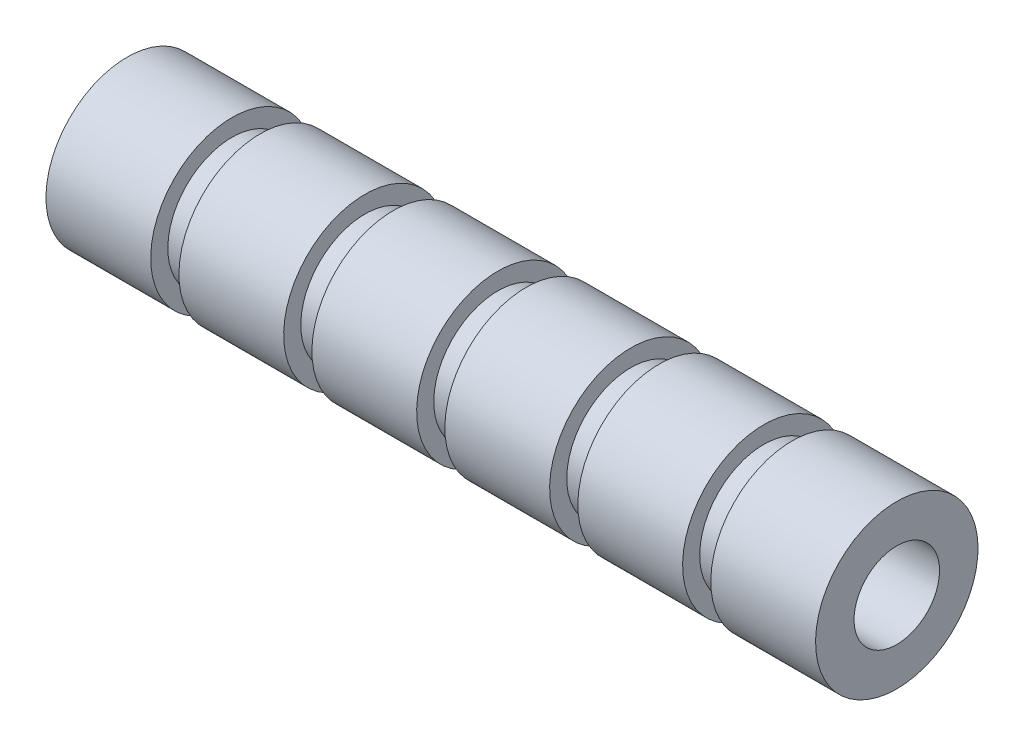
ISO-10303-21;
HEADER;
FILE_DESCRIPTION(('STEP AP214'),'2;1');
FILE_NAME('part.step','',(''),(''),'','','');
FILE_SCHEMA(('AUTOMOTIVE_DESIGN { 1 0 10303 214 1 1 1 1 }'));
ENDSEC;
DATA;
#1=APPLICATION_CONTEXT('core data for automotive mechanical design processes');
#2=APPLICATION_PROTOCOL_DEFINITION('international standard','automotive_design',2000,#1);
#3=PRODUCT_CONTEXT('',#1,'mechanical');
#4=PRODUCT('Part','Part','',(#3));
#5=PRODUCT_RELATED_PRODUCT_CATEGORY('part','',(#4));
#6=PRODUCT_DEFINITION_FORMATION('','',#4);
#7=PRODUCT_DEFINITION_CONTEXT('part definition',#1,'design');
#8=PRODUCT_DEFINITION('design','',#6,#7);
#9=PRODUCT_DEFINITION_SHAPE('','',#8);
#10=(LENGTH_UNIT() NAMED_UNIT(*) SI_UNIT(.MILLI.,.METRE.));
#11=(NAMED_UNIT(*) PLANE_ANGLE_UNIT() SI_UNIT($,.RADIAN.));
#12=(NAMED_UNIT(*) SI_UNIT($,.STERADIAN.) SOLID_ANGLE_UNIT());
#13=UNCERTAINTY_MEASURE_WITH_UNIT(LENGTH_MEASURE(1.E-05),#10,'distance_accuracy_value','');
#14=(GEOMETRIC_REPRESENTATION_CONTEXT(3) GLOBAL_UNCERTAINTY_ASSIGNED_CONTEXT((#13)) GLOBAL_UNIT_ASSIGNED_CONTEXT((#10,
#11,#12)) REPRESENTATION_CONTEXT('',''));
#15=CARTESIAN_POINT('',(0.,0.,0.));
#16=DIRECTION('',(0.,0.,1.));
#17=DIRECTION('',(1.,0.,0.));
#18=AXIS2_PLACEMENT_3D('',#15,#16,#17);
#19=CARTESIAN_POINT('',(45.,0.,0.));
#20=DIRECTION('',(-1.,0.,0.));
#21=DIRECTION('',(0.,-1.,0.));
#22=AXIS2_PLACEMENT_3D('',#19,#20,#21);
#23=PLANE('',#22);
#24=CARTESIAN_POINT('',(45.,0.,0.));
#25=DIRECTION('',(1.,0.,0.));
#26=DIRECTION('',(0.,1.,0.));
#27=AXIS2_PLACEMENT_3D('',#24,#25,#26);
#28=CIRCLE('',#27,5.);
#29=CARTESIAN_POINT('',(45.,5.00000000000001,0.));
#30=VERTEX_POINT('',#29);
#31=EDGE_CURVE('E109',#30,#30,#28,.T.);
#32=ORIENTED_EDGE('',*,*,#31,.F.);
#33=EDGE_LOOP('',(#32));
#34=FACE_BOUND('',#33,.T.);
#35=CARTESIAN_POINT('',(45.,0.,0.));
#36=DIRECTION('',(-1.,0.,0.));
#37=DIRECTION('',(0.,-1.,0.));
#38=AXIS2_PLACEMENT_3D('',#35,#36,#37);
#39=CIRCLE('',#38,9.49999999999994);
#40=CARTESIAN_POINT('',(45.,-9.49999999999986,0.));
#41=VERTEX_POINT('',#40);
#42=EDGE_CURVE('E10',#41,#41,#39,.T.);
#43=ORIENTED_EDGE('',*,*,#42,.F.);
#44=EDGE_LOOP('',(#43));
#45=FACE_BOUND('',#44,.T.);
#46=ADVANCED_FACE('F35',(#34,#45),#23,.F.);
#47=CARTESIAN_POINT('',(-45.,0.,0.));
#48=DIRECTION('',(-1.,0.,0.));
#49=DIRECTION('',(0.,-1.,0.));
#50=AXIS2_PLACEMENT_3D('',#47,#48,#49);
#51=CYLINDRICAL_SURFACE('',#50,9.49999999999994);
#52=CARTESIAN_POINT('',(32.75,0.,0.));
#53=DIRECTION('',(-1.,0.,0.));
#54=DIRECTION('',(0.,-1.,0.));
#55=AXIS2_PLACEMENT_3D('',#52,#53,#54);
#56=CIRCLE('',#55,9.49999999999994);
#57=CARTESIAN_POINT('',(32.75,-9.49999999999986,0.));
#58=VERTEX_POINT('',#57);
#59=EDGE_CURVE('E41',#58,#58,#56,.T.);
#60=ORIENTED_EDGE('',*,*,#59,.F.);
#61=EDGE_LOOP('',(#60));
#62=FACE_BOUND('',#61,.T.);
#63=ORIENTED_EDGE('',*,*,#42,.T.);
#64=EDGE_LOOP('',(#63));
#65=FACE_BOUND('',#64,.T.);
#66=ADVANCED_FACE('F126',(#62,#65),#51,.T.);
#67=CARTESIAN_POINT('',(32.75,9.50000000000002,0.));
#68=DIRECTION('',(1.,0.,0.));
#69=DIRECTION('',(0.,1.,0.));
#70=AXIS2_PLACEMENT_3D('',#67,#68,#69);
#71=PLANE('',#70);
#72=CARTESIAN_POINT('',(32.75,0.,0.));
#73=DIRECTION('',(-1.,0.,0.));
#74=DIRECTION('',(0.,-1.,0.));
#75=AXIS2_PLACEMENT_3D('',#72,#73,#74);
#76=CIRCLE('',#75,7.49999999999993);
#77=CARTESIAN_POINT('',(32.75,-7.49999999999985,0.));
#78=VERTEX_POINT('',#77);
#79=EDGE_CURVE('E45',#78,#78,#76,.T.);
#80=ORIENTED_EDGE('',*,*,#79,.F.);
#81=EDGE_LOOP('',(#80));
#82=FACE_BOUND('',#81,.T.);
#83=ORIENTED_EDGE('',*,*,#59,.T.);
#84=EDGE_LOOP('',(#83));
#85=FACE_BOUND('',#84,.T.);
#86=ADVANCED_FACE('F132',(#82,#85),#71,.F.);
#87=CARTESIAN_POINT('',(-45.,0.,0.));
#88=DIRECTION('',(-1.,0.,0.));
#89=DIRECTION('',(0.,-1.,0.));
#90=AXIS2_PLACEMENT_3D('',#87,#88,#89);
#91=CYLINDRICAL_SURFACE('',#90,7.49999999999993);
#92=CARTESIAN_POINT('',(29.45,0.,0.));
#93=DIRECTION('',(-1.,0.,0.));
#94=DIRECTION('',(0.,-1.,0.));
#95=AXIS2_PLACEMENT_3D('',#92,#93,#94);
#96=CIRCLE('',#95,7.49999999999993);
#97=CARTESIAN_POINT('',(29.45,-7.49999999999985,0.));
#98=VERTEX_POINT('',#97);
#99=EDGE_CURVE('E49',#98,#98,#96,.T.);
#100=ORIENTED_EDGE('',*,*,#99,.F.);
#101=EDGE_LOOP('',(#100));
#102=FACE_BOUND('',#101,.T.);
#103=ORIENTED_EDGE('',*,*,#79,.T.);
#104=EDGE_LOOP('',(#103));
#105=FACE_BOUND('',#104,.T.);
#106=ADVANCED_FACE('F137',(#102,#105),#91,.T.);
#107=CARTESIAN_POINT('',(29.45,7.50000000000001,0.));
#108=DIRECTION('',(-1.,0.,0.));
#109=DIRECTION('',(0.,-1.,0.));
#110=AXIS2_PLACEMENT_3D('',#107,#108,#109);
#111=PLANE('',#110);
#112=CARTESIAN_POINT('',(29.45,0.,0.));
#113=DIRECTION('',(-1.,0.,0.));
#114=DIRECTION('',(0.,-1.,0.));
#115=AXIS2_PLACEMENT_3D('',#112,#113,#114);
#116=CIRCLE('',#115,9.49999999999994);
#117=CARTESIAN_POINT('',(29.45,-9.49999999999986,0.));
#118=VERTEX_POINT('',#117);
#119=EDGE_CURVE('E54',#118,#118,#116,.T.);
#120=ORIENTED_EDGE('',*,*,#119,.F.);
#121=EDGE_LOOP('',(#120));
#122=FACE_BOUND('',#121,.T.);
#123=ORIENTED_EDGE('',*,*,#99,.T.);
#124=EDGE_LOOP('',(#123));
#125=FACE_BOUND('',#124,.T.);
#126=ADVANCED_FACE('F143',(#122,#125),#111,.F.);
#127=CARTESIAN_POINT('',(-45.,0.,0.));
#128=DIRECTION('',(-1.,0.,0.));
#129=DIRECTION('',(0.,-1.,0.));
#130=AXIS2_PLACEMENT_3D('',#127,#128,#129);
#131=CYLINDRICAL_SURFACE('',#130,9.49999999999995);
#132=CARTESIAN_POINT('',(17.2,0.,0.));
#133=DIRECTION('',(-1.,0.,0.));
#134=DIRECTION('',(0.,-1.,0.));
#135=AXIS2_PLACEMENT_3D('',#132,#133,#134);
#136=CIRCLE('',#135,9.49999999999995);
#137=CARTESIAN_POINT('',(17.2,-9.49999999999987,0.));
#138=VERTEX_POINT('',#137);
#139=EDGE_CURVE('E57',#138,#138,#136,.T.);
#140=ORIENTED_EDGE('',*,*,#139,.F.);
#141=EDGE_LOOP('',(#140));
#142=FACE_BOUND('',#141,.T.);
#143=ORIENTED_EDGE('',*,*,#119,.T.);
#144=EDGE_LOOP('',(#143));
#145=FACE_BOUND('',#144,.T.);
#146=ADVANCED_FACE('F147',(#142,#145),#131,.T.);
#147=CARTESIAN_POINT('',(17.2,9.50000000000002,0.));
#148=DIRECTION('',(1.,0.,0.));
#149=DIRECTION('',(0.,1.,0.));
#150=AXIS2_PLACEMENT_3D('',#147,#148,#149);
#151=PLANE('',#150);
#152=CARTESIAN_POINT('',(17.2,0.,0.));
#153=DIRECTION('',(-1.,0.,0.));
#154=DIRECTION('',(0.,-1.,0.));
#155=AXIS2_PLACEMENT_3D('',#152,#153,#154);
#156=CIRCLE('',#155,7.49999999999993);
#157=CARTESIAN_POINT('',(17.2,-7.49999999999985,0.));
#158=VERTEX_POINT('',#157);
#159=EDGE_CURVE('E60',#158,#158,#156,.T.);
#160=ORIENTED_EDGE('',*,*,#159,.F.);
#161=EDGE_LOOP('',(#160));
#162=FACE_BOUND('',#161,.T.);
#163=ORIENTED_EDGE('',*,*,#139,.T.);
#164=EDGE_LOOP('',(#163));
#165=FACE_BOUND('',#164,.T.);
#166=ADVANCED_FACE('F151',(#162,#165),#151,.F.);
#167=CARTESIAN_POINT('',(-45.,0.,0.));
#168=DIRECTION('',(-1.,0.,0.));
#169=DIRECTION('',(0.,-1.,0.));
#170=AXIS2_PLACEMENT_3D('',#167,#168,#169);
#171=CYLINDRICAL_SURFACE('',#170,7.49999999999993);
#172=CARTESIAN_POINT('',(13.9,0.,0.));
#173=DIRECTION('',(-1.,0.,0.));
#174=DIRECTION('',(0.,-1.,0.));
#175=AXIS2_PLACEMENT_3D('',#172,#173,#174);
#176=CIRCLE('',#175,7.49999999999993);
#177=CARTESIAN_POINT('',(13.9,-7.49999999999986,0.));
#178=VERTEX_POINT('',#177);
#179=EDGE_CURVE('E63',#178,#178,#176,.T.);
#180=ORIENTED_EDGE('',*,*,#179,.F.);
#181=EDGE_LOOP('',(#180));
#182=FACE_BOUND('',#181,.T.);
#183=ORIENTED_EDGE('',*,*,#159,.T.);
#184=EDGE_LOOP('',(#183));
#185=FACE_BOUND('',#184,.T.);
#186=ADVANCED_FACE('F155',(#182,#185),#171,.T.);
#187=CARTESIAN_POINT('',(13.9,7.50000000000001,0.));
#188=DIRECTION('',(-1.,0.,0.));
#189=DIRECTION('',(0.,-1.,0.));
#190=AXIS2_PLACEMENT_3D('',#187,#188,#189);
#191=PLANE('',#190);
#192=CARTESIAN_POINT('',(13.9,0.,0.));
#193=DIRECTION('',(-1.,0.,0.));
#194=DIRECTION('',(0.,-1.,0.));
#195=AXIS2_PLACEMENT_3D('',#192,#193,#194);
#196=CIRCLE('',#195,9.49999999999995);
#197=CARTESIAN_POINT('',(13.9,-9.49999999999987,0.));
#198=VERTEX_POINT('',#197);
#199=EDGE_CURVE('E66',#198,#198,#196,.T.);
#200=ORIENTED_EDGE('',*,*,#199,.F.);
#201=EDGE_LOOP('',(#200));
#202=FACE_BOUND('',#201,.T.);
#203=ORIENTED_EDGE('',*,*,#179,.T.);
#204=EDGE_LOOP('',(#203));
#205=FACE_BOUND('',#204,.T.);
#206=ADVANCED_FACE('F159',(#202,#205),#191,.F.);
#207=CARTESIAN_POINT('',(-45.,0.,0.));
#208=DIRECTION('',(-1.,0.,0.));
#209=DIRECTION('',(0.,-1.,0.));
#210=AXIS2_PLACEMENT_3D('',#207,#208,#209);
#211=CYLINDRICAL_SURFACE('',#210,9.49999999999994);
#212=CARTESIAN_POINT('',(1.65,0.,0.));
#213=DIRECTION('',(-1.,0.,0.));
#214=DIRECTION('',(0.,-1.,0.));
#215=AXIS2_PLACEMENT_3D('',#212,#213,#214);
#216=CIRCLE('',#215,9.49999999999994);
#217=CARTESIAN_POINT('',(1.65,-9.49999999999987,0.));
#218=VERTEX_POINT('',#217);
#219=EDGE_CURVE('E69',#218,#218,#216,.T.);
#220=ORIENTED_EDGE('',*,*,#219,.F.);
#221=EDGE_LOOP('',(#220));
#222=FACE_BOUND('',#221,.T.);
#223=ORIENTED_EDGE('',*,*,#199,.T.);
#224=EDGE_LOOP('',(#223));
#225=FACE_BOUND('',#224,.T.);
#226=ADVANCED_FACE('F163',(#222,#225),#211,.T.);
#227=CARTESIAN_POINT('',(1.65,9.50000000000001,0.));
#228=DIRECTION('',(1.,0.,0.));
#229=DIRECTION('',(0.,1.,0.));
#230=AXIS2_PLACEMENT_3D('',#227,#228,#229);
#231=PLANE('',#230);
#232=CARTESIAN_POINT('',(1.65,0.,0.));
#233=DIRECTION('',(-1.,0.,0.));
#234=DIRECTION('',(0.,-1.,0.));
#235=AXIS2_PLACEMENT_3D('',#232,#233,#234);
#236=CIRCLE('',#235,7.49999999999994);
#237=CARTESIAN_POINT('',(1.65,-7.49999999999987,0.));
#238=VERTEX_POINT('',#237);
#239=EDGE_CURVE('E72',#238,#238,#236,.T.);
#240=ORIENTED_EDGE('',*,*,#239,.F.);
#241=EDGE_LOOP('',(#240));
#242=FACE_BOUND('',#241,.T.);
#243=ORIENTED_EDGE('',*,*,#219,.T.);
#244=EDGE_LOOP('',(#243));
#245=FACE_BOUND('',#244,.T.);
#246=ADVANCED_FACE('F167',(#242,#245),#231,.F.);
#247=CARTESIAN_POINT('',(-45.,0.,0.));
#248=DIRECTION('',(-1.,0.,0.));
#249=DIRECTION('',(0.,-1.,0.));
#250=AXIS2_PLACEMENT_3D('',#247,#248,#249);
#251=CYLINDRICAL_SURFACE('',#250,7.49999999999994);
#252=CARTESIAN_POINT('',(-1.65,0.,0.));
#253=DIRECTION('',(-1.,0.,0.));
#254=DIRECTION('',(0.,-1.,0.));
#255=AXIS2_PLACEMENT_3D('',#252,#253,#254);
#256=CIRCLE('',#255,7.49999999999994);
#257=CARTESIAN_POINT('',(-1.65,-7.49999999999987,0.));
#258=VERTEX_POINT('',#257);
#259=EDGE_CURVE('E75',#258,#258,#256,.T.);
#260=ORIENTED_EDGE('',*,*,#259,.F.);
#261=EDGE_LOOP('',(#260));
#262=FACE_BOUND('',#261,.T.);
#263=ORIENTED_EDGE('',*,*,#239,.T.);
#264=EDGE_LOOP('',(#263));
#265=FACE_BOUND('',#264,.T.);
#266=ADVANCED_FACE('F171',(#262,#265),#251,.T.);
#267=CARTESIAN_POINT('',(-1.65,7.50000000000001,0.));
#268=DIRECTION('',(-1.,0.,0.));
#269=DIRECTION('',(0.,-1.,0.));
#270=AXIS2_PLACEMENT_3D('',#267,#268,#269);
#271=PLANE('',#270);
#272=CARTESIAN_POINT('',(-1.65,0.,0.));
#273=DIRECTION('',(-1.,0.,0.));
#274=DIRECTION('',(0.,-1.,0.));
#275=AXIS2_PLACEMENT_3D('',#272,#273,#274);
#276=CIRCLE('',#275,9.49999999999994);
#277=CARTESIAN_POINT('',(-1.65,-9.49999999999987,0.));
#278=VERTEX_POINT('',#277);
#279=EDGE_CURVE('E78',#278,#278,#276,.T.);
#280=ORIENTED_EDGE('',*,*,#279,.F.);
#281=EDGE_LOOP('',(#280));
#282=FACE_BOUND('',#281,.T.);
#283=ORIENTED_EDGE('',*,*,#259,.T.);
#284=EDGE_LOOP('',(#283));
#285=FACE_BOUND('',#284,.T.);
#286=ADVANCED_FACE('F175',(#282,#285),#271,.F.);
#287=CARTESIAN_POINT('',(-45.,0.,0.));
#288=DIRECTION('',(-1.,0.,0.));
#289=DIRECTION('',(0.,-1.,0.));
#290=AXIS2_PLACEMENT_3D('',#287,#288,#289);
#291=CYLINDRICAL_SURFACE('',#290,9.49999999999995);
#292=CARTESIAN_POINT('',(-13.9,0.,0.));
#293=DIRECTION('',(-1.,0.,0.));
#294=DIRECTION('',(0.,-1.,0.));
#295=AXIS2_PLACEMENT_3D('',#292,#293,#294);
#296=CIRCLE('',#295,9.49999999999996);
#297=CARTESIAN_POINT('',(-13.9,-9.49999999999989,0.));
#298=VERTEX_POINT('',#297);
#299=EDGE_CURVE('E81',#298,#298,#296,.T.);
#300=ORIENTED_EDGE('',*,*,#299,.F.);
#301=EDGE_LOOP('',(#300));
#302=FACE_BOUND('',#301,.T.);
#303=ORIENTED_EDGE('',*,*,#279,.T.);
#304=EDGE_LOOP('',(#303));
#305=FACE_BOUND('',#304,.T.);
#306=ADVANCED_FACE('F179',(#302,#305),#291,.T.);
#307=CARTESIAN_POINT('',(-13.9,9.50000000000002,0.));
#308=DIRECTION('',(1.,0.,0.));
#309=DIRECTION('',(0.,1.,0.));
#310=AXIS2_PLACEMENT_3D('',#307,#308,#309);
#311=PLANE('',#310);
#312=CARTESIAN_POINT('',(-13.9,0.,0.));
#313=DIRECTION('',(-1.,0.,0.));
#314=DIRECTION('',(0.,-1.,0.));
#315=AXIS2_PLACEMENT_3D('',#312,#313,#314);
#316=CIRCLE('',#315,7.49999999999994);
#317=CARTESIAN_POINT('',(-13.9,-7.49999999999987,0.));
#318=VERTEX_POINT('',#317);
#319=EDGE_CURVE('E84',#318,#318,#316,.T.);
#320=ORIENTED_EDGE('',*,*,#319,.F.);
#321=EDGE_LOOP('',(#320));
#322=FACE_BOUND('',#321,.T.);
#323=ORIENTED_EDGE('',*,*,#299,.T.);
#324=EDGE_LOOP('',(#323));
#325=FACE_BOUND('',#324,.T.);
#326=ADVANCED_FACE('F183',(#322,#325),#311,.F.);
#327=CARTESIAN_POINT('',(-45.,0.,0.));
#328=DIRECTION('',(-1.,0.,0.));
#329=DIRECTION('',(0.,-1.,0.));
#330=AXIS2_PLACEMENT_3D('',#327,#328,#329);
#331=CYLINDRICAL_SURFACE('',#330,7.49999999999994);
#332=CARTESIAN_POINT('',(-17.2,0.,0.));
#333=DIRECTION('',(-1.,0.,0.));
#334=DIRECTION('',(0.,-1.,0.));
#335=AXIS2_PLACEMENT_3D('',#332,#333,#334);
#336=CIRCLE('',#335,7.49999999999994);
#337=CARTESIAN_POINT('',(-17.2,-7.49999999999987,0.));
#338=VERTEX_POINT('',#337);
#339=EDGE_CURVE('E87',#338,#338,#336,.T.);
#340=ORIENTED_EDGE('',*,*,#339,.F.);
#341=EDGE_LOOP('',(#340));
#342=FACE_BOUND('',#341,.T.);
#343=ORIENTED_EDGE('',*,*,#319,.T.);
#344=EDGE_LOOP('',(#343));
#345=FACE_BOUND('',#344,.T.);
#346=ADVANCED_FACE('F187',(#342,#345),#331,.T.);
#347=CARTESIAN_POINT('',(-17.2,7.50000000000001,0.));
#348=DIRECTION('',(-1.,0.,0.));
#349=DIRECTION('',(0.,-1.,0.));
#350=AXIS2_PLACEMENT_3D('',#347,#348,#349);
#351=PLANE('',#350);
#352=CARTESIAN_POINT('',(-17.2,0.,0.));
#353=DIRECTION('',(-1.,0.,0.));
#354=DIRECTION('',(0.,-1.,0.));
#355=AXIS2_PLACEMENT_3D('',#352,#353,#354);
#356=CIRCLE('',#355,9.49999999999996);
#357=CARTESIAN_POINT('',(-17.2,-9.49999999999989,0.));
#358=VERTEX_POINT('',#357);
#359=EDGE_CURVE('E90',#358,#358,#356,.T.);
#360=ORIENTED_EDGE('',*,*,#359,.F.);
#361=EDGE_LOOP('',(#360));
#362=FACE_BOUND('',#361,.T.);
#363=ORIENTED_EDGE('',*,*,#339,.T.);
#364=EDGE_LOOP('',(#363));
#365=FACE_BOUND('',#364,.T.);
#366=ADVANCED_FACE('F191',(#362,#365),#351,.F.);
#367=CARTESIAN_POINT('',(-45.,0.,0.));
#368=DIRECTION('',(-1.,0.,0.));
#369=DIRECTION('',(0.,-1.,0.));
#370=AXIS2_PLACEMENT_3D('',#367,#368,#369);
#371=CYLINDRICAL_SURFACE('',#370,9.49999999999996);
#372=CARTESIAN_POINT('',(-29.45,0.,0.));
#373=DIRECTION('',(-1.,0.,0.));
#374=DIRECTION('',(0.,-1.,0.));
#375=AXIS2_PLACEMENT_3D('',#372,#373,#374);
#376=CIRCLE('',#375,9.49999999999996);
#377=CARTESIAN_POINT('',(-29.45,-9.49999999999989,0.));
#378=VERTEX_POINT('',#377);
#379=EDGE_CURVE('E93',#378,#378,#376,.T.);
#380=ORIENTED_EDGE('',*,*,#379,.F.);
#381=EDGE_LOOP('',(#380));
#382=FACE_BOUND('',#381,.T.);
#383=ORIENTED_EDGE('',*,*,#359,.T.);
#384=EDGE_LOOP('',(#383));
#385=FACE_BOUND('',#384,.T.);
#386=ADVANCED_FACE('F195',(#382,#385),#371,.T.);
#387=CARTESIAN_POINT('',(-29.45,9.50000000000002,0.));
#388=DIRECTION('',(1.,0.,0.));
#389=DIRECTION('',(0.,1.,0.));
#390=AXIS2_PLACEMENT_3D('',#387,#388,#389);
#391=PLANE('',#390);
#392=CARTESIAN_POINT('',(-29.45,0.,0.));
#393=DIRECTION('',(-1.,0.,0.));
#394=DIRECTION('',(0.,-1.,0.));
#395=AXIS2_PLACEMENT_3D('',#392,#393,#394);
#396=CIRCLE('',#395,7.49999999999994);
#397=CARTESIAN_POINT('',(-29.45,-7.49999999999988,0.));
#398=VERTEX_POINT('',#397);
#399=EDGE_CURVE('E96',#398,#398,#396,.T.);
#400=ORIENTED_EDGE('',*,*,#399,.F.);
#401=EDGE_LOOP('',(#400));
#402=FACE_BOUND('',#401,.T.);
#403=ORIENTED_EDGE('',*,*,#379,.T.);
#404=EDGE_LOOP('',(#403));
#405=FACE_BOUND('',#404,.T.);
#406=ADVANCED_FACE('F199',(#402,#405),#391,.F.);
#407=CARTESIAN_POINT('',(-45.,0.,0.));
#408=DIRECTION('',(-1.,0.,0.));
#409=DIRECTION('',(0.,-1.,0.));
#410=AXIS2_PLACEMENT_3D('',#407,#408,#409);
#411=CYLINDRICAL_SURFACE('',#410,7.49999999999994);
#412=CARTESIAN_POINT('',(-32.75,0.,0.));
#413=DIRECTION('',(-1.,0.,0.));
#414=DIRECTION('',(0.,-1.,0.));
#415=AXIS2_PLACEMENT_3D('',#412,#413,#414);
#416=CIRCLE('',#415,7.49999999999994);
#417=CARTESIAN_POINT('',(-32.75,-7.49999999999988,0.));
#418=VERTEX_POINT('',#417);
#419=EDGE_CURVE('E99',#418,#418,#416,.T.);
#420=ORIENTED_EDGE('',*,*,#419,.F.);
#421=EDGE_LOOP('',(#420));
#422=FACE_BOUND('',#421,.T.);
#423=ORIENTED_EDGE('',*,*,#399,.T.);
#424=EDGE_LOOP('',(#423));
#425=FACE_BOUND('',#424,.T.);
#426=ADVANCED_FACE('F203',(#422,#425),#411,.T.);
#427=CARTESIAN_POINT('',(-32.75,7.50000000000001,0.));
#428=DIRECTION('',(-1.,0.,0.));
#429=DIRECTION('',(0.,-1.,0.));
#430=AXIS2_PLACEMENT_3D('',#427,#428,#429);
#431=PLANE('',#430);
#432=CARTESIAN_POINT('',(-32.75,0.,0.));
#433=DIRECTION('',(-1.,0.,0.));
#434=DIRECTION('',(0.,-1.,0.));
#435=AXIS2_PLACEMENT_3D('',#432,#433,#434);
#436=CIRCLE('',#435,9.49999999999996);
#437=CARTESIAN_POINT('',(-32.75,-9.4999999999999,0.));
#438=VERTEX_POINT('',#437);
#439=EDGE_CURVE('E102',#438,#438,#436,.T.);
#440=ORIENTED_EDGE('',*,*,#439,.F.);
#441=EDGE_LOOP('',(#440));
#442=FACE_BOUND('',#441,.T.);
#443=ORIENTED_EDGE('',*,*,#419,.T.);
#444=EDGE_LOOP('',(#443));
#445=FACE_BOUND('',#444,.T.);
#446=ADVANCED_FACE('F207',(#442,#445),#431,.F.);
#447=CARTESIAN_POINT('',(-45.,0.,0.));
#448=DIRECTION('',(-1.,0.,0.));
#449=DIRECTION('',(0.,-1.,0.));
#450=AXIS2_PLACEMENT_3D('',#447,#448,#449);
#451=CYLINDRICAL_SURFACE('',#450,9.49999999999996);
#452=CARTESIAN_POINT('',(-45.,0.,0.));
#453=DIRECTION('',(-1.,0.,0.));
#454=DIRECTION('',(0.,-1.,0.));
#455=AXIS2_PLACEMENT_3D('',#452,#453,#454);
#456=CIRCLE('',#455,9.49999999999996);
#457=CARTESIAN_POINT('',(-45.,-9.4999999999999,0.));
#458=VERTEX_POINT('',#457);
#459=EDGE_CURVE('E105',#458,#458,#456,.T.);
#460=ORIENTED_EDGE('',*,*,#459,.F.);
#461=EDGE_LOOP('',(#460));
#462=FACE_BOUND('',#461,.T.);
#463=ORIENTED_EDGE('',*,*,#439,.T.);
#464=EDGE_LOOP('',(#463));
#465=FACE_BOUND('',#464,.T.);
#466=ADVANCED_FACE('F211',(#462,#465),#451,.T.);
#467=CARTESIAN_POINT('',(-45.,9.50000000000002,0.));
#468=DIRECTION('',(1.,0.,0.));
#469=DIRECTION('',(0.,1.,0.));
#470=AXIS2_PLACEMENT_3D('',#467,#468,#469);
#471=PLANE('',#470);
#472=CARTESIAN_POINT('',(-45.,0.,0.));
#473=DIRECTION('',(1.,0.,0.));
#474=DIRECTION('',(0.,1.,0.));
#475=AXIS2_PLACEMENT_3D('',#472,#473,#474);
#476=CIRCLE('',#475,5.);
#477=CARTESIAN_POINT('',(-45.,4.99999999999997,0.));
#478=VERTEX_POINT('',#477);
#479=EDGE_CURVE('E108',#478,#478,#476,.T.);
#480=ORIENTED_EDGE('',*,*,#479,.T.);
#481=EDGE_LOOP('',(#480));
#482=FACE_BOUND('',#481,.T.);
#483=ORIENTED_EDGE('',*,*,#459,.T.);
#484=EDGE_LOOP('',(#483));
#485=FACE_BOUND('',#484,.T.);
#486=ADVANCED_FACE('F115',(#482,#485),#471,.F.);
#487=CARTESIAN_POINT('',(-45.,0.,0.));
#488=DIRECTION('',(1.,0.,0.));
#489=DIRECTION('',(0.,1.,0.));
#490=AXIS2_PLACEMENT_3D('',#487,#488,#489);
#491=CYLINDRICAL_SURFACE('',#490,5.);
#492=CARTESIAN_POINT('',(-45.,4.99999999999997,0.));
#493=CARTESIAN_POINT('',(-44.0625,4.99999999999997,0.));
#494=CARTESIAN_POINT('',(-43.125,4.99999999999997,0.));
#495=CARTESIAN_POINT('',(-41.25,4.99999999999997,0.));
#496=CARTESIAN_POINT('',(-40.3125,4.99999999999997,0.));
#497=CARTESIAN_POINT('',(-38.4375,4.99999999999997,0.));
#498=CARTESIAN_POINT('',(-37.5,4.99999999999997,0.));
#499=CARTESIAN_POINT('',(-35.625,4.99999999999997,0.));
#500=CARTESIAN_POINT('',(-34.6875,4.99999999999997,0.));
#501=CARTESIAN_POINT('',(-32.8125,4.99999999999997,0.));
#502=CARTESIAN_POINT('',(-31.875,4.99999999999997,0.));
#503=CARTESIAN_POINT('',(-30.,4.99999999999998,0.));
#504=CARTESIAN_POINT('',(-29.0625,4.99999999999998,0.));
#505=CARTESIAN_POINT('',(-27.1875,4.99999999999998,0.));
#506=CARTESIAN_POINT('',(-26.25,4.99999999999998,0.));
#507=CARTESIAN_POINT('',(-24.375,4.99999999999998,0.));
#508=CARTESIAN_POINT('',(-23.4375,4.99999999999998,0.));
#509=CARTESIAN_POINT('',(-21.5625,4.99999999999998,0.));
#510=CARTESIAN_POINT('',(-20.625,4.99999999999998,0.));
#511=CARTESIAN_POINT('',(-18.75,4.99999999999998,0.));
#512=CARTESIAN_POINT('',(-17.8125,4.99999999999998,0.));
#513=CARTESIAN_POINT('',(-15.9375,4.99999999999998,0.));
#514=CARTESIAN_POINT('',(-15.,4.99999999999998,0.));
#515=CARTESIAN_POINT('',(-13.125,4.99999999999998,0.));
#516=CARTESIAN_POINT('',(-12.1875,4.99999999999998,0.));
#517=CARTESIAN_POINT('',(-10.3125,4.99999999999998,0.));
#518=CARTESIAN_POINT('',(-9.37500000000002,4.99999999999999,0.));
#519=CARTESIAN_POINT('',(-7.50000000000002,4.99999999999999,0.));
#520=CARTESIAN_POINT('',(-6.56250000000002,4.99999999999999,0.));
#521=CARTESIAN_POINT('',(-4.68750000000002,4.99999999999999,0.));
#522=CARTESIAN_POINT('',(-3.75000000000002,4.99999999999999,0.));
#523=CARTESIAN_POINT('',(-1.87500000000002,4.99999999999999,0.));
#524=CARTESIAN_POINT('',(-0.937500000000015,4.99999999999999,0.));
#525=CARTESIAN_POINT('',(0.937499999999987,4.99999999999999,0.));
#526=CARTESIAN_POINT('',(1.87499999999999,4.99999999999999,0.));
#527=CARTESIAN_POINT('',(3.74999999999999,4.99999999999999,0.));
#528=CARTESIAN_POINT('',(4.68749999999999,4.99999999999999,0.));
#529=CARTESIAN_POINT('',(6.56249999999999,4.99999999999999,0.));
#530=CARTESIAN_POINT('',(7.49999999999999,4.99999999999999,0.));
#531=CARTESIAN_POINT('',(9.37499999999999,4.99999999999999,0.));
#532=CARTESIAN_POINT('',(10.3125,4.99999999999999,0.));
#533=CARTESIAN_POINT('',(12.1875,5.,0.));
#534=CARTESIAN_POINT('',(13.125,5.,0.));
#535=CARTESIAN_POINT('',(15.,5.,0.));
#536=CARTESIAN_POINT('',(15.9375,5.,0.));
#537=CARTESIAN_POINT('',(17.8125,5.,0.));
#538=CARTESIAN_POINT('',(18.75,5.,0.));
#539=CARTESIAN_POINT('',(20.625,5.,0.));
#540=CARTESIAN_POINT('',(21.5625,5.,0.));
#541=CARTESIAN_POINT('',(23.4375,5.,0.));
#542=CARTESIAN_POINT('',(24.375,5.,0.));
#543=CARTESIAN_POINT('',(26.25,5.,0.));
#544=CARTESIAN_POINT('',(27.1875,5.,0.));
#545=CARTESIAN_POINT('',(29.0625,5.,0.));
#546=CARTESIAN_POINT('',(30.,5.,0.));
#547=CARTESIAN_POINT('',(31.875,5.00000000000001,0.));
#548=CARTESIAN_POINT('',(32.8125,5.00000000000001,0.));
#549=CARTESIAN_POINT('',(34.6875,5.00000000000001,0.));
#550=CARTESIAN_POINT('',(35.625,5.00000000000001,0.));
#551=CARTESIAN_POINT('',(37.5,5.00000000000001,0.));
#552=CARTESIAN_POINT('',(38.4375,5.00000000000001,0.));
#553=CARTESIAN_POINT('',(40.3125,5.00000000000001,0.));
#554=CARTESIAN_POINT('',(41.25,5.00000000000001,0.));
#555=CARTESIAN_POINT('',(43.125,5.00000000000001,0.));
#556=CARTESIAN_POINT('',(44.0625,5.00000000000001,0.));
#557=CARTESIAN_POINT('',(45.,5.00000000000001,0.));
#558=B_SPLINE_CURVE_WITH_KNOTS('',3,(#492,#493,#494,#495,#496,#497,#498,#499,#500,#501,#502,
#503,#504,#505,#506,#507,#508,#509,#510,#511,#512,#513,#514,#515,#516,#517,#518,#519,#520,#521,
#522,#523,#524,#525,#526,#527,#528,#529,#530,#531,#532,#533,#534,#535,#536,#537,#538,#539,#540,
#541,#542,#543,#544,#545,#546,#547,#548,#549,#550,#551,#552,#553,#554,#555,#556,#557),
.UNSPECIFIED.,.F.,.F.,(4,2,2,2,2,2,2,2,2,2,2,2,2,2,2,2,2,2,2,2,2,2,2,2,2,2,2,2,2,2,2,2,4),(0.,
2.8125,5.62500000000001,8.43750000000001,11.25,14.0625,16.875,19.6875,22.5,25.3125,28.125,
30.9375,33.75,36.5625,39.375,42.1875,45.,47.8125,50.625,53.4375,56.25,59.0625,61.875,64.6875,
67.5,70.3125,73.125,75.9375,78.75,81.5625,84.375,87.1875,90.),.UNSPECIFIED.);
#559=EDGE_CURVE('BSEAM118',#478,#30,#558,.T.);
#560=ORIENTED_EDGE('',*,*,#479,.F.);
#561=ORIENTED_EDGE('',*,*,#31,.T.);
#562=ORIENTED_EDGE('',*,*,#559,.T.);
#563=ORIENTED_EDGE('',*,*,#559,.F.);
#564=EDGE_LOOP('',(#560,#562,#561,#563));
#565=FACE_BOUND('',#564,.T.);
#566=ADVANCED_FACE('F118',(#565),#491,.F.);
#567=CLOSED_SHELL('',(#46,#66,#86,#106,#126,#146,#166,#186,#206,#226,#246,#266,#286,#306,#326,
#346,#366,#386,#406,#426,#446,#466,#486,#566));
#568=MANIFOLD_SOLID_BREP('B2',#567);
#569=ADVANCED_BREP_SHAPE_REPRESENTATION('',(#18,#568),#14);
#570=SHAPE_DEFINITION_REPRESENTATION(#9,#569);
ENDSEC;
END-ISO-10303-21;
